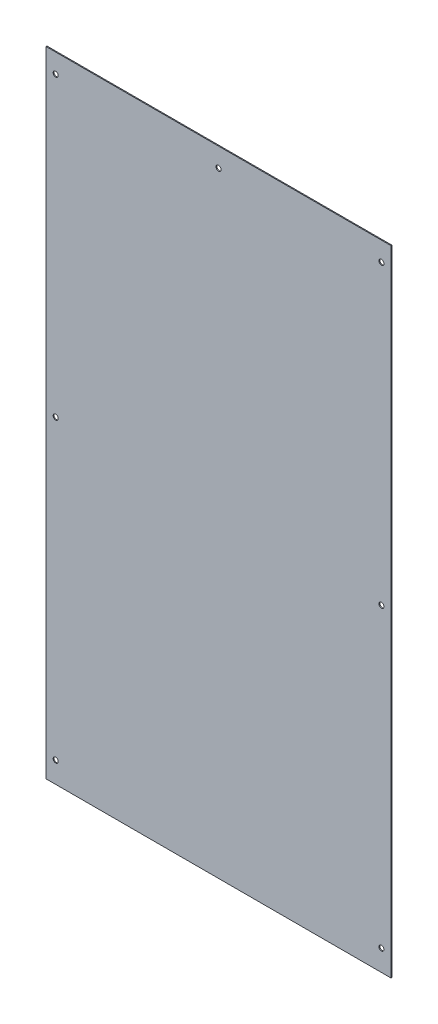
ISO-10303-21;
HEADER;
FILE_DESCRIPTION(('STEP AP214'),'2;1');
FILE_NAME('part.step','',(''),(''),'','','');
FILE_SCHEMA(('AUTOMOTIVE_DESIGN { 1 0 10303 214 1 1 1 1 }'));
ENDSEC;
DATA;
#1=APPLICATION_CONTEXT('core data for automotive mechanical design processes');
#2=APPLICATION_PROTOCOL_DEFINITION('international standard','automotive_design',2000,#1);
#3=PRODUCT_CONTEXT('',#1,'mechanical');
#4=PRODUCT('Part','Part','',(#3));
#5=PRODUCT_RELATED_PRODUCT_CATEGORY('part','',(#4));
#6=PRODUCT_DEFINITION_FORMATION('','',#4);
#7=PRODUCT_DEFINITION_CONTEXT('part definition',#1,'design');
#8=PRODUCT_DEFINITION('design','',#6,#7);
#9=PRODUCT_DEFINITION_SHAPE('','',#8);
#10=(LENGTH_UNIT() NAMED_UNIT(*) SI_UNIT(.MILLI.,.METRE.));
#11=(NAMED_UNIT(*) PLANE_ANGLE_UNIT() SI_UNIT($,.RADIAN.));
#12=(NAMED_UNIT(*) SI_UNIT($,.STERADIAN.) SOLID_ANGLE_UNIT());
#13=UNCERTAINTY_MEASURE_WITH_UNIT(LENGTH_MEASURE(1.E-05),#10,'distance_accuracy_value','');
#14=(GEOMETRIC_REPRESENTATION_CONTEXT(3) GLOBAL_UNCERTAINTY_ASSIGNED_CONTEXT((#13)) GLOBAL_UNIT_ASSIGNED_CONTEXT((#10,
#11,#12)) REPRESENTATION_CONTEXT('',''));
#15=CARTESIAN_POINT('',(0.,0.,0.));
#16=DIRECTION('',(0.,0.,1.));
#17=DIRECTION('',(1.,0.,0.));
#18=AXIS2_PLACEMENT_3D('',#15,#16,#17);
#19=CARTESIAN_POINT('',(0.,0.,1.2192));
#20=DIRECTION('',(1.,0.,0.));
#21=DIRECTION('',(0.,0.,-1.));
#22=AXIS2_PLACEMENT_3D('',#19,#20,#21);
#23=PLANE('',#22);
#24=DIRECTION('',(0.,-1.,0.));
#25=VECTOR('',#24,1.);
#26=CARTESIAN_POINT('',(0.,0.,0.));
#27=LINE('',#26,#25);
#28=CARTESIAN_POINT('',(0.,840.74,0.));
#29=VERTEX_POINT('',#28);
#30=CARTESIAN_POINT('',(0.,0.,0.));
#31=VERTEX_POINT('',#30);
#32=EDGE_CURVE('E97',#29,#31,#27,.T.);
#33=ORIENTED_EDGE('',*,*,#32,.T.);
#34=DIRECTION('',(0.,0.,-1.));
#35=VECTOR('',#34,1.);
#36=CARTESIAN_POINT('',(0.,0.,1.2192));
#37=LINE('',#36,#35);
#38=CARTESIAN_POINT('',(0.,0.,1.2192));
#39=VERTEX_POINT('',#38);
#40=EDGE_CURVE('E11',#39,#31,#37,.T.);
#41=ORIENTED_EDGE('',*,*,#40,.F.);
#42=DIRECTION('',(0.,-1.,0.));
#43=VECTOR('',#42,1.);
#44=CARTESIAN_POINT('',(0.,0.,1.2192));
#45=LINE('',#44,#43);
#46=CARTESIAN_POINT('',(0.,840.74,1.2192));
#47=VERTEX_POINT('',#46);
#48=EDGE_CURVE('E85',#47,#39,#45,.T.);
#49=ORIENTED_EDGE('',*,*,#48,.F.);
#50=DIRECTION('',(0.,0.,-1.));
#51=VECTOR('',#50,1.);
#52=CARTESIAN_POINT('',(0.,840.74,1.2192));
#53=LINE('',#52,#51);
#54=EDGE_CURVE('E93',#47,#29,#53,.T.);
#55=ORIENTED_EDGE('',*,*,#54,.T.);
#56=EDGE_LOOP('',(#33,#41,#49,#55));
#57=FACE_BOUND('',#56,.T.);
#58=ADVANCED_FACE('F34',(#57),#23,.F.);
#59=CARTESIAN_POINT('',(0.,0.,1.2192));
#60=DIRECTION('',(0.,1.,0.));
#61=DIRECTION('',(0.,0.,1.));
#62=AXIS2_PLACEMENT_3D('',#59,#60,#61);
#63=PLANE('',#62);
#64=DIRECTION('',(1.,0.,0.));
#65=VECTOR('',#64,1.);
#66=CARTESIAN_POINT('',(0.,0.,0.));
#67=LINE('',#66,#65);
#68=CARTESIAN_POINT('',(457.2,0.,0.));
#69=VERTEX_POINT('',#68);
#70=EDGE_CURVE('E89',#31,#69,#67,.T.);
#71=ORIENTED_EDGE('',*,*,#70,.T.);
#72=DIRECTION('',(0.,0.,-1.));
#73=VECTOR('',#72,1.);
#74=CARTESIAN_POINT('',(457.2,0.,1.2192));
#75=LINE('',#74,#73);
#76=CARTESIAN_POINT('',(457.2,0.,1.2192));
#77=VERTEX_POINT('',#76);
#78=EDGE_CURVE('E42',#77,#69,#75,.T.);
#79=ORIENTED_EDGE('',*,*,#78,.F.);
#80=DIRECTION('',(1.,0.,0.));
#81=VECTOR('',#80,1.);
#82=CARTESIAN_POINT('',(0.,0.,1.2192));
#83=LINE('',#82,#81);
#84=EDGE_CURVE('E80',#39,#77,#83,.T.);
#85=ORIENTED_EDGE('',*,*,#84,.F.);
#86=ORIENTED_EDGE('',*,*,#40,.T.);
#87=EDGE_LOOP('',(#71,#79,#85,#86));
#88=FACE_BOUND('',#87,.T.);
#89=ADVANCED_FACE('F88',(#88),#63,.F.);
#90=CARTESIAN_POINT('',(457.2,0.,1.2192));
#91=DIRECTION('',(-1.,0.,0.));
#92=DIRECTION('',(0.,0.,1.));
#93=AXIS2_PLACEMENT_3D('',#90,#91,#92);
#94=PLANE('',#93);
#95=DIRECTION('',(0.,1.,0.));
#96=VECTOR('',#95,1.);
#97=CARTESIAN_POINT('',(457.2,0.,0.));
#98=LINE('',#97,#96);
#99=CARTESIAN_POINT('',(457.2,840.74,0.));
#100=VERTEX_POINT('',#99);
#101=EDGE_CURVE('E67',#69,#100,#98,.T.);
#102=ORIENTED_EDGE('',*,*,#101,.T.);
#103=DIRECTION('',(0.,0.,-1.));
#104=VECTOR('',#103,1.);
#105=CARTESIAN_POINT('',(457.2,840.74,1.2192));
#106=LINE('',#105,#104);
#107=CARTESIAN_POINT('',(457.2,840.74,1.2192));
#108=VERTEX_POINT('',#107);
#109=EDGE_CURVE('E90',#108,#100,#106,.T.);
#110=ORIENTED_EDGE('',*,*,#109,.F.);
#111=DIRECTION('',(0.,1.,0.));
#112=VECTOR('',#111,1.);
#113=CARTESIAN_POINT('',(457.2,0.,1.2192));
#114=LINE('',#113,#112);
#115=EDGE_CURVE('E83',#77,#108,#114,.T.);
#116=ORIENTED_EDGE('',*,*,#115,.F.);
#117=ORIENTED_EDGE('',*,*,#78,.T.);
#118=EDGE_LOOP('',(#102,#110,#116,#117));
#119=FACE_BOUND('',#118,.T.);
#120=ADVANCED_FACE('F91',(#119),#94,.F.);
#121=CARTESIAN_POINT('',(0.,840.74,1.2192));
#122=DIRECTION('',(0.,-1.,0.));
#123=DIRECTION('',(0.,0.,-1.));
#124=AXIS2_PLACEMENT_3D('',#121,#122,#123);
#125=PLANE('',#124);
#126=DIRECTION('',(-1.,0.,0.));
#127=VECTOR('',#126,1.);
#128=CARTESIAN_POINT('',(0.,840.74,0.));
#129=LINE('',#128,#127);
#130=EDGE_CURVE('E73',#100,#29,#129,.T.);
#131=ORIENTED_EDGE('',*,*,#130,.T.);
#132=ORIENTED_EDGE('',*,*,#54,.F.);
#133=DIRECTION('',(-1.,0.,0.));
#134=VECTOR('',#133,1.);
#135=CARTESIAN_POINT('',(0.,840.74,1.2192));
#136=LINE('',#135,#134);
#137=EDGE_CURVE('E50',#108,#47,#136,.T.);
#138=ORIENTED_EDGE('',*,*,#137,.F.);
#139=ORIENTED_EDGE('',*,*,#109,.T.);
#140=EDGE_LOOP('',(#131,#132,#138,#139));
#141=FACE_BOUND('',#140,.T.);
#142=ADVANCED_FACE('F105',(#141),#125,.F.);
#143=CARTESIAN_POINT('',(0.,0.,1.2192));
#144=DIRECTION('',(0.,0.,-1.));
#145=DIRECTION('',(-1.,0.,0.));
#146=AXIS2_PLACEMENT_3D('',#143,#144,#145);
#147=PLANE('',#146);
#148=CARTESIAN_POINT('',(12.7,815.34,1.2192));
#149=DIRECTION('',(0.,0.,1.));
#150=DIRECTION('',(1.,0.,0.));
#151=AXIS2_PLACEMENT_3D('',#148,#149,#150);
#152=CIRCLE('',#151,3.37819999999999);
#153=CARTESIAN_POINT('',(16.0782,815.34,1.2192));
#154=VERTEX_POINT('',#153);
#155=EDGE_CURVE('E149',#154,#154,#152,.T.);
#156=ORIENTED_EDGE('',*,*,#155,.F.);
#157=EDGE_LOOP('',(#156));
#158=FACE_BOUND('',#157,.T.);
#159=CARTESIAN_POINT('',(228.6,815.34,1.2192));
#160=DIRECTION('',(0.,0.,1.));
#161=DIRECTION('',(1.,0.,0.));
#162=AXIS2_PLACEMENT_3D('',#159,#160,#161);
#163=CIRCLE('',#162,3.3782);
#164=CARTESIAN_POINT('',(231.9782,815.34,1.2192));
#165=VERTEX_POINT('',#164);
#166=EDGE_CURVE('E143',#165,#165,#163,.T.);
#167=ORIENTED_EDGE('',*,*,#166,.F.);
#168=EDGE_LOOP('',(#167));
#169=FACE_BOUND('',#168,.T.);
#170=CARTESIAN_POINT('',(444.5,815.34,1.2192));
#171=DIRECTION('',(0.,0.,1.));
#172=DIRECTION('',(1.,0.,0.));
#173=AXIS2_PLACEMENT_3D('',#170,#171,#172);
#174=CIRCLE('',#173,3.3782);
#175=CARTESIAN_POINT('',(447.8782,815.34,1.2192));
#176=VERTEX_POINT('',#175);
#177=EDGE_CURVE('E137',#176,#176,#174,.T.);
#178=ORIENTED_EDGE('',*,*,#177,.F.);
#179=EDGE_LOOP('',(#178));
#180=FACE_BOUND('',#179,.T.);
#181=CARTESIAN_POINT('',(444.5,421.64,1.2192));
#182=DIRECTION('',(0.,0.,1.));
#183=DIRECTION('',(1.,0.,0.));
#184=AXIS2_PLACEMENT_3D('',#181,#182,#183);
#185=CIRCLE('',#184,3.3782);
#186=CARTESIAN_POINT('',(447.8782,421.64,1.2192));
#187=VERTEX_POINT('',#186);
#188=EDGE_CURVE('E131',#187,#187,#185,.T.);
#189=ORIENTED_EDGE('',*,*,#188,.F.);
#190=EDGE_LOOP('',(#189));
#191=FACE_BOUND('',#190,.T.);
#192=CARTESIAN_POINT('',(12.7000000000001,421.64,1.2192));
#193=DIRECTION('',(0.,0.,1.));
#194=DIRECTION('',(1.,0.,0.));
#195=AXIS2_PLACEMENT_3D('',#192,#193,#194);
#196=CIRCLE('',#195,3.37819999999999);
#197=CARTESIAN_POINT('',(16.0782000000001,421.64,1.2192));
#198=VERTEX_POINT('',#197);
#199=EDGE_CURVE('E125',#198,#198,#196,.T.);
#200=ORIENTED_EDGE('',*,*,#199,.F.);
#201=EDGE_LOOP('',(#200));
#202=FACE_BOUND('',#201,.T.);
#203=CARTESIAN_POINT('',(12.7000000000002,27.9399999999999,1.2192));
#204=DIRECTION('',(0.,0.,1.));
#205=DIRECTION('',(1.,0.,0.));
#206=AXIS2_PLACEMENT_3D('',#203,#204,#205);
#207=CIRCLE('',#206,3.37819999999999);
#208=CARTESIAN_POINT('',(16.0782000000002,27.9399999999999,1.2192));
#209=VERTEX_POINT('',#208);
#210=EDGE_CURVE('E119',#209,#209,#207,.T.);
#211=ORIENTED_EDGE('',*,*,#210,.F.);
#212=EDGE_LOOP('',(#211));
#213=FACE_BOUND('',#212,.T.);
#214=CARTESIAN_POINT('',(444.5,27.9399999999997,1.2192));
#215=DIRECTION('',(0.,0.,1.));
#216=DIRECTION('',(1.,0.,0.));
#217=AXIS2_PLACEMENT_3D('',#214,#215,#216);
#218=CIRCLE('',#217,3.3782);
#219=CARTESIAN_POINT('',(447.8782,27.9399999999997,1.2192));
#220=VERTEX_POINT('',#219);
#221=EDGE_CURVE('E113',#220,#220,#218,.T.);
#222=ORIENTED_EDGE('',*,*,#221,.F.);
#223=EDGE_LOOP('',(#222));
#224=FACE_BOUND('',#223,.T.);
#225=ORIENTED_EDGE('',*,*,#48,.T.);
#226=ORIENTED_EDGE('',*,*,#84,.T.);
#227=ORIENTED_EDGE('',*,*,#115,.T.);
#228=ORIENTED_EDGE('',*,*,#137,.T.);
#229=EDGE_LOOP('',(#225,#226,#227,#228));
#230=FACE_BOUND('',#229,.T.);
#231=ADVANCED_FACE('F81',(#158,#169,#180,#191,#202,#213,#224,#230),#147,.F.);
#232=CARTESIAN_POINT('',(0.,0.,0.));
#233=DIRECTION('',(0.,0.,-1.));
#234=DIRECTION('',(-1.,0.,0.));
#235=AXIS2_PLACEMENT_3D('',#232,#233,#234);
#236=PLANE('',#235);
#237=CARTESIAN_POINT('',(12.7,815.34,0.));
#238=DIRECTION('',(0.,0.,1.));
#239=DIRECTION('',(1.,0.,0.));
#240=AXIS2_PLACEMENT_3D('',#237,#238,#239);
#241=CIRCLE('',#240,3.3782);
#242=CARTESIAN_POINT('',(16.0782,815.34,0.));
#243=VERTEX_POINT('',#242);
#244=EDGE_CURVE('E146',#243,#243,#241,.T.);
#245=ORIENTED_EDGE('',*,*,#244,.T.);
#246=EDGE_LOOP('',(#245));
#247=FACE_BOUND('',#246,.T.);
#248=CARTESIAN_POINT('',(228.6,815.34,0.));
#249=DIRECTION('',(0.,0.,1.));
#250=DIRECTION('',(1.,0.,0.));
#251=AXIS2_PLACEMENT_3D('',#248,#249,#250);
#252=CIRCLE('',#251,3.3782);
#253=CARTESIAN_POINT('',(231.9782,815.34,0.));
#254=VERTEX_POINT('',#253);
#255=EDGE_CURVE('E140',#254,#254,#252,.T.);
#256=ORIENTED_EDGE('',*,*,#255,.T.);
#257=EDGE_LOOP('',(#256));
#258=FACE_BOUND('',#257,.T.);
#259=CARTESIAN_POINT('',(444.5,815.34,0.));
#260=DIRECTION('',(0.,0.,1.));
#261=DIRECTION('',(1.,0.,0.));
#262=AXIS2_PLACEMENT_3D('',#259,#260,#261);
#263=CIRCLE('',#262,3.3782);
#264=CARTESIAN_POINT('',(447.8782,815.34,0.));
#265=VERTEX_POINT('',#264);
#266=EDGE_CURVE('E134',#265,#265,#263,.T.);
#267=ORIENTED_EDGE('',*,*,#266,.T.);
#268=EDGE_LOOP('',(#267));
#269=FACE_BOUND('',#268,.T.);
#270=CARTESIAN_POINT('',(444.5,421.64,0.));
#271=DIRECTION('',(0.,0.,1.));
#272=DIRECTION('',(1.,0.,0.));
#273=AXIS2_PLACEMENT_3D('',#270,#271,#272);
#274=CIRCLE('',#273,3.3782);
#275=CARTESIAN_POINT('',(447.8782,421.64,0.));
#276=VERTEX_POINT('',#275);
#277=EDGE_CURVE('E128',#276,#276,#274,.T.);
#278=ORIENTED_EDGE('',*,*,#277,.T.);
#279=EDGE_LOOP('',(#278));
#280=FACE_BOUND('',#279,.T.);
#281=CARTESIAN_POINT('',(12.7000000000001,421.64,0.));
#282=DIRECTION('',(0.,0.,1.));
#283=DIRECTION('',(1.,0.,0.));
#284=AXIS2_PLACEMENT_3D('',#281,#282,#283);
#285=CIRCLE('',#284,3.3782);
#286=CARTESIAN_POINT('',(16.0782000000001,421.64,0.));
#287=VERTEX_POINT('',#286);
#288=EDGE_CURVE('E122',#287,#287,#285,.T.);
#289=ORIENTED_EDGE('',*,*,#288,.T.);
#290=EDGE_LOOP('',(#289));
#291=FACE_BOUND('',#290,.T.);
#292=CARTESIAN_POINT('',(12.7000000000002,27.9399999999999,0.));
#293=DIRECTION('',(0.,0.,1.));
#294=DIRECTION('',(1.,0.,0.));
#295=AXIS2_PLACEMENT_3D('',#292,#293,#294);
#296=CIRCLE('',#295,3.3782);
#297=CARTESIAN_POINT('',(16.0782000000002,27.9399999999999,0.));
#298=VERTEX_POINT('',#297);
#299=EDGE_CURVE('E116',#298,#298,#296,.T.);
#300=ORIENTED_EDGE('',*,*,#299,.T.);
#301=EDGE_LOOP('',(#300));
#302=FACE_BOUND('',#301,.T.);
#303=CARTESIAN_POINT('',(444.5,27.9399999999997,0.));
#304=DIRECTION('',(0.,0.,1.));
#305=DIRECTION('',(1.,0.,0.));
#306=AXIS2_PLACEMENT_3D('',#303,#304,#305);
#307=CIRCLE('',#306,3.3782);
#308=CARTESIAN_POINT('',(447.8782,27.9399999999997,0.));
#309=VERTEX_POINT('',#308);
#310=EDGE_CURVE('E100',#309,#309,#307,.T.);
#311=ORIENTED_EDGE('',*,*,#310,.T.);
#312=EDGE_LOOP('',(#311));
#313=FACE_BOUND('',#312,.T.);
#314=ORIENTED_EDGE('',*,*,#32,.F.);
#315=ORIENTED_EDGE('',*,*,#130,.F.);
#316=ORIENTED_EDGE('',*,*,#101,.F.);
#317=ORIENTED_EDGE('',*,*,#70,.F.);
#318=EDGE_LOOP('',(#314,#315,#316,#317));
#319=FACE_BOUND('',#318,.T.);
#320=ADVANCED_FACE('F108',(#247,#258,#269,#280,#291,#302,#313,#319),#236,.T.);
#321=CARTESIAN_POINT('',(444.5,27.9399999999997,1.2192));
#322=DIRECTION('',(0.,0.,1.));
#323=DIRECTION('',(1.,0.,0.));
#324=AXIS2_PLACEMENT_3D('',#321,#322,#323);
#325=CYLINDRICAL_SURFACE('',#324,3.3782);
#326=ORIENTED_EDGE('',*,*,#310,.F.);
#327=EDGE_LOOP('',(#326));
#328=FACE_BOUND('',#327,.T.);
#329=ORIENTED_EDGE('',*,*,#221,.T.);
#330=EDGE_LOOP('',(#329));
#331=FACE_BOUND('',#330,.T.);
#332=ADVANCED_FACE('F170',(#328,#331),#325,.F.);
#333=CARTESIAN_POINT('',(12.7000000000002,27.9399999999999,1.2192));
#334=DIRECTION('',(0.,0.,1.));
#335=DIRECTION('',(1.,0.,0.));
#336=AXIS2_PLACEMENT_3D('',#333,#334,#335);
#337=CYLINDRICAL_SURFACE('',#336,3.37819999999999);
#338=ORIENTED_EDGE('',*,*,#299,.F.);
#339=EDGE_LOOP('',(#338));
#340=FACE_BOUND('',#339,.T.);
#341=ORIENTED_EDGE('',*,*,#210,.T.);
#342=EDGE_LOOP('',(#341));
#343=FACE_BOUND('',#342,.T.);
#344=ADVANCED_FACE('F172',(#340,#343),#337,.F.);
#345=CARTESIAN_POINT('',(12.7000000000001,421.64,1.2192));
#346=DIRECTION('',(0.,0.,1.));
#347=DIRECTION('',(1.,0.,0.));
#348=AXIS2_PLACEMENT_3D('',#345,#346,#347);
#349=CYLINDRICAL_SURFACE('',#348,3.37819999999999);
#350=ORIENTED_EDGE('',*,*,#288,.F.);
#351=EDGE_LOOP('',(#350));
#352=FACE_BOUND('',#351,.T.);
#353=ORIENTED_EDGE('',*,*,#199,.T.);
#354=EDGE_LOOP('',(#353));
#355=FACE_BOUND('',#354,.T.);
#356=ADVANCED_FACE('F179',(#352,#355),#349,.F.);
#357=CARTESIAN_POINT('',(444.5,421.64,1.2192));
#358=DIRECTION('',(0.,0.,1.));
#359=DIRECTION('',(1.,0.,0.));
#360=AXIS2_PLACEMENT_3D('',#357,#358,#359);
#361=CYLINDRICAL_SURFACE('',#360,3.3782);
#362=ORIENTED_EDGE('',*,*,#277,.F.);
#363=EDGE_LOOP('',(#362));
#364=FACE_BOUND('',#363,.T.);
#365=ORIENTED_EDGE('',*,*,#188,.T.);
#366=EDGE_LOOP('',(#365));
#367=FACE_BOUND('',#366,.T.);
#368=ADVANCED_FACE('F226',(#364,#367),#361,.F.);
#369=CARTESIAN_POINT('',(444.5,815.34,1.2192));
#370=DIRECTION('',(0.,0.,1.));
#371=DIRECTION('',(1.,0.,0.));
#372=AXIS2_PLACEMENT_3D('',#369,#370,#371);
#373=CYLINDRICAL_SURFACE('',#372,3.3782);
#374=ORIENTED_EDGE('',*,*,#266,.F.);
#375=EDGE_LOOP('',(#374));
#376=FACE_BOUND('',#375,.T.);
#377=ORIENTED_EDGE('',*,*,#177,.T.);
#378=EDGE_LOOP('',(#377));
#379=FACE_BOUND('',#378,.T.);
#380=ADVANCED_FACE('F236',(#376,#379),#373,.F.);
#381=CARTESIAN_POINT('',(228.6,815.34,1.2192));
#382=DIRECTION('',(0.,0.,1.));
#383=DIRECTION('',(1.,0.,0.));
#384=AXIS2_PLACEMENT_3D('',#381,#382,#383);
#385=CYLINDRICAL_SURFACE('',#384,3.3782);
#386=ORIENTED_EDGE('',*,*,#255,.F.);
#387=EDGE_LOOP('',(#386));
#388=FACE_BOUND('',#387,.T.);
#389=ORIENTED_EDGE('',*,*,#166,.T.);
#390=EDGE_LOOP('',(#389));
#391=FACE_BOUND('',#390,.T.);
#392=ADVANCED_FACE('F246',(#388,#391),#385,.F.);
#393=CARTESIAN_POINT('',(12.7,815.34,1.2192));
#394=DIRECTION('',(0.,0.,1.));
#395=DIRECTION('',(1.,0.,0.));
#396=AXIS2_PLACEMENT_3D('',#393,#394,#395);
#397=CYLINDRICAL_SURFACE('',#396,3.37819999999999);
#398=ORIENTED_EDGE('',*,*,#244,.F.);
#399=EDGE_LOOP('',(#398));
#400=FACE_BOUND('',#399,.T.);
#401=ORIENTED_EDGE('',*,*,#155,.T.);
#402=EDGE_LOOP('',(#401));
#403=FACE_BOUND('',#402,.T.);
#404=ADVANCED_FACE('F153',(#400,#403),#397,.F.);
#405=CLOSED_SHELL('',(#58,#89,#120,#142,#231,#320,#332,#344,#356,#368,#380,#392,#404));
#406=MANIFOLD_SOLID_BREP('B2',#405);
#407=ADVANCED_BREP_SHAPE_REPRESENTATION('',(#18,#406),#14);
#408=SHAPE_DEFINITION_REPRESENTATION(#9,#407);
ENDSEC;
END-ISO-10303-21;
